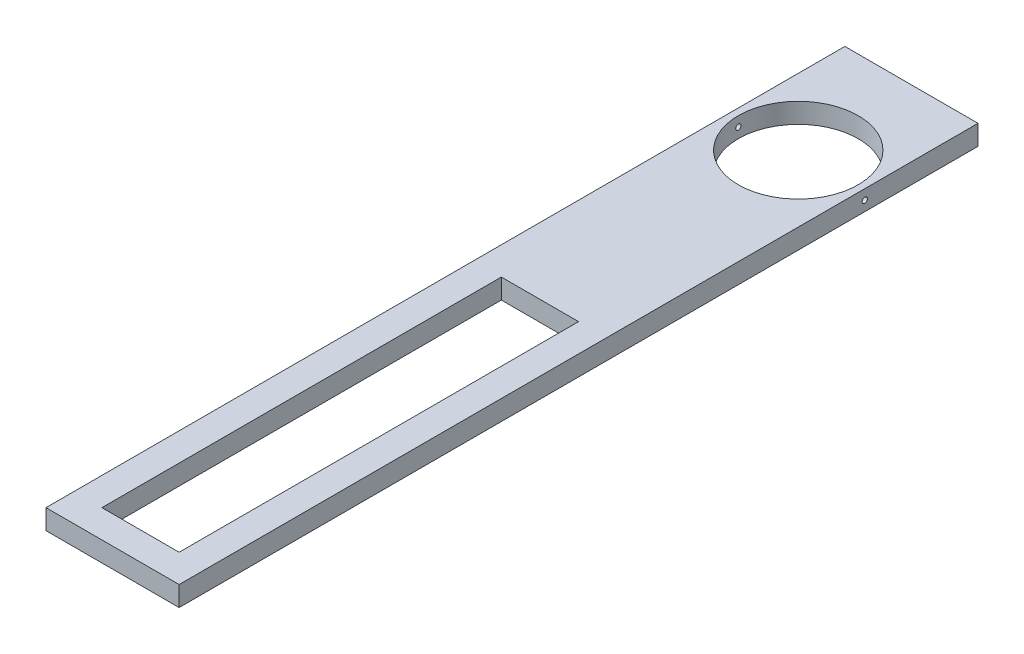
ISO-10303-21;
HEADER;
FILE_DESCRIPTION(('STEP AP214'),'2;1');
FILE_NAME('part.step','',(''),(''),'','','');
FILE_SCHEMA(('AUTOMOTIVE_DESIGN { 1 0 10303 214 1 1 1 1 }'));
ENDSEC;
DATA;
#1=APPLICATION_CONTEXT('core data for automotive mechanical design processes');
#2=APPLICATION_PROTOCOL_DEFINITION('international standard','automotive_design',2000,#1);
#3=PRODUCT_CONTEXT('',#1,'mechanical');
#4=PRODUCT('Part','Part','',(#3));
#5=PRODUCT_RELATED_PRODUCT_CATEGORY('part','',(#4));
#6=PRODUCT_DEFINITION_FORMATION('','',#4);
#7=PRODUCT_DEFINITION_CONTEXT('part definition',#1,'design');
#8=PRODUCT_DEFINITION('design','',#6,#7);
#9=PRODUCT_DEFINITION_SHAPE('','',#8);
#10=(LENGTH_UNIT() NAMED_UNIT(*) SI_UNIT(.MILLI.,.METRE.));
#11=(NAMED_UNIT(*) PLANE_ANGLE_UNIT() SI_UNIT($,.RADIAN.));
#12=(NAMED_UNIT(*) SI_UNIT($,.STERADIAN.) SOLID_ANGLE_UNIT());
#13=UNCERTAINTY_MEASURE_WITH_UNIT(LENGTH_MEASURE(1.E-05),#10,'distance_accuracy_value','');
#14=(GEOMETRIC_REPRESENTATION_CONTEXT(3) GLOBAL_UNCERTAINTY_ASSIGNED_CONTEXT((#13)) GLOBAL_UNIT_ASSIGNED_CONTEXT((#10,
#11,#12)) REPRESENTATION_CONTEXT('',''));
#15=CARTESIAN_POINT('',(0.,0.,0.));
#16=DIRECTION('',(0.,0.,1.));
#17=DIRECTION('',(1.,0.,0.));
#18=AXIS2_PLACEMENT_3D('',#15,#16,#17);
#19=CARTESIAN_POINT('',(0.,-15.,0.));
#20=DIRECTION('',(0.,1.,0.));
#21=DIRECTION('',(0.,0.,1.));
#22=AXIS2_PLACEMENT_3D('',#19,#20,#21);
#23=PLANE('',#22);
#24=CARTESIAN_POINT('',(0.,-15.,-344.));
#25=DIRECTION('',(0.,1.,0.));
#26=DIRECTION('',(0.,0.,1.));
#27=AXIS2_PLACEMENT_3D('',#24,#25,#26);
#28=CIRCLE('',#27,45.0000000000001);
#29=CARTESIAN_POINT('',(0.,-15.,-299.));
#30=VERTEX_POINT('',#29);
#31=EDGE_CURVE('E269',#30,#30,#28,.T.);
#32=ORIENTED_EDGE('',*,*,#31,.T.);
#33=EDGE_LOOP('',(#32));
#34=FACE_BOUND('',#33,.T.);
#35=DIRECTION('',(0.,0.,1.));
#36=VECTOR('',#35,1.);
#37=CARTESIAN_POINT('',(50.0000000000001,-15.,0.));
#38=LINE('',#37,#36);
#39=CARTESIAN_POINT('',(50.0000000000001,-15.,-429.));
#40=VERTEX_POINT('',#39);
#41=CARTESIAN_POINT('',(50.,-15.,171.));
#42=VERTEX_POINT('',#41);
#43=EDGE_CURVE('E165',#40,#42,#38,.T.);
#44=ORIENTED_EDGE('',*,*,#43,.T.);
#45=DIRECTION('',(1.,0.,0.));
#46=VECTOR('',#45,1.);
#47=CARTESIAN_POINT('',(0.,-15.,171.));
#48=LINE('',#47,#46);
#49=CARTESIAN_POINT('',(-50.,-15.,171.));
#50=VERTEX_POINT('',#49);
#51=EDGE_CURVE('E176',#50,#42,#48,.T.);
#52=ORIENTED_EDGE('',*,*,#51,.F.);
#53=DIRECTION('',(0.,0.,1.));
#54=VECTOR('',#53,1.);
#55=CARTESIAN_POINT('',(-50.,-15.,0.));
#56=LINE('',#55,#54);
#57=CARTESIAN_POINT('',(-50.0000000000001,-15.,-429.));
#58=VERTEX_POINT('',#57);
#59=EDGE_CURVE('E172',#58,#50,#56,.T.);
#60=ORIENTED_EDGE('',*,*,#59,.F.);
#61=DIRECTION('',(1.,0.,0.));
#62=VECTOR('',#61,1.);
#63=CARTESIAN_POINT('',(0.,-15.,-429.));
#64=LINE('',#63,#62);
#65=EDGE_CURVE('E168',#58,#40,#64,.T.);
#66=ORIENTED_EDGE('',*,*,#65,.T.);
#67=EDGE_LOOP('',(#44,#52,#60,#66));
#68=FACE_BOUND('',#67,.T.);
#69=DIRECTION('',(0.,0.,1.));
#70=VECTOR('',#69,1.);
#71=CARTESIAN_POINT('',(29.,-15.,0.));
#72=LINE('',#71,#70);
#73=CARTESIAN_POINT('',(29.,-15.,-150.));
#74=VERTEX_POINT('',#73);
#75=CARTESIAN_POINT('',(29.,-15.,150.));
#76=VERTEX_POINT('',#75);
#77=EDGE_CURVE('E161',#74,#76,#72,.T.);
#78=ORIENTED_EDGE('',*,*,#77,.F.);
#79=DIRECTION('',(1.,0.,0.));
#80=VECTOR('',#79,1.);
#81=CARTESIAN_POINT('',(0.,-15.,-150.));
#82=LINE('',#81,#80);
#83=CARTESIAN_POINT('',(-29.,-15.,-150.));
#84=VERTEX_POINT('',#83);
#85=EDGE_CURVE('E148',#84,#74,#82,.T.);
#86=ORIENTED_EDGE('',*,*,#85,.F.);
#87=DIRECTION('',(0.,0.,1.));
#88=VECTOR('',#87,1.);
#89=CARTESIAN_POINT('',(-29.,-15.,0.));
#90=LINE('',#89,#88);
#91=CARTESIAN_POINT('',(-29.,-15.,150.));
#92=VERTEX_POINT('',#91);
#93=EDGE_CURVE('E123',#84,#92,#90,.T.);
#94=ORIENTED_EDGE('',*,*,#93,.T.);
#95=DIRECTION('',(1.,0.,0.));
#96=VECTOR('',#95,1.);
#97=CARTESIAN_POINT('',(0.,-15.,150.));
#98=LINE('',#97,#96);
#99=EDGE_CURVE('E157',#92,#76,#98,.T.);
#100=ORIENTED_EDGE('',*,*,#99,.T.);
#101=EDGE_LOOP('',(#78,#86,#94,#100));
#102=FACE_BOUND('',#101,.T.);
#103=ADVANCED_FACE('F45',(#34,#68,#102),#23,.F.);
#104=CARTESIAN_POINT('',(0.,0.,0.));
#105=DIRECTION('',(0.,1.,0.));
#106=DIRECTION('',(0.,0.,1.));
#107=AXIS2_PLACEMENT_3D('',#104,#105,#106);
#108=PLANE('',#107);
#109=CARTESIAN_POINT('',(0.,0.,-344.));
#110=DIRECTION('',(0.,1.,0.));
#111=DIRECTION('',(0.,0.,1.));
#112=AXIS2_PLACEMENT_3D('',#109,#110,#111);
#113=CIRCLE('',#112,45.0000000000001);
#114=CARTESIAN_POINT('',(0.,0.,-299.));
#115=VERTEX_POINT('',#114);
#116=EDGE_CURVE('E272',#115,#115,#113,.T.);
#117=ORIENTED_EDGE('',*,*,#116,.F.);
#118=EDGE_LOOP('',(#117));
#119=FACE_BOUND('',#118,.T.);
#120=DIRECTION('',(0.,0.,1.));
#121=VECTOR('',#120,1.);
#122=CARTESIAN_POINT('',(50.0000000000001,0.,0.));
#123=LINE('',#122,#121);
#124=CARTESIAN_POINT('',(50.0000000000001,0.,-429.));
#125=VERTEX_POINT('',#124);
#126=CARTESIAN_POINT('',(50.,0.,171.));
#127=VERTEX_POINT('',#126);
#128=EDGE_CURVE('E164',#125,#127,#123,.T.);
#129=ORIENTED_EDGE('',*,*,#128,.F.);
#130=DIRECTION('',(1.,0.,0.));
#131=VECTOR('',#130,1.);
#132=CARTESIAN_POINT('',(0.,0.,-429.));
#133=LINE('',#132,#131);
#134=CARTESIAN_POINT('',(-50.0000000000001,0.,-429.));
#135=VERTEX_POINT('',#134);
#136=EDGE_CURVE('E184',#135,#125,#133,.T.);
#137=ORIENTED_EDGE('',*,*,#136,.F.);
#138=DIRECTION('',(0.,0.,1.));
#139=VECTOR('',#138,1.);
#140=CARTESIAN_POINT('',(-50.,0.,0.));
#141=LINE('',#140,#139);
#142=CARTESIAN_POINT('',(-50.,0.,171.));
#143=VERTEX_POINT('',#142);
#144=EDGE_CURVE('E187',#135,#143,#141,.T.);
#145=ORIENTED_EDGE('',*,*,#144,.T.);
#146=DIRECTION('',(1.,0.,0.));
#147=VECTOR('',#146,1.);
#148=CARTESIAN_POINT('',(0.,0.,171.));
#149=LINE('',#148,#147);
#150=EDGE_CURVE('E169',#143,#127,#149,.T.);
#151=ORIENTED_EDGE('',*,*,#150,.T.);
#152=EDGE_LOOP('',(#129,#137,#145,#151));
#153=FACE_BOUND('',#152,.T.);
#154=DIRECTION('',(1.,0.,0.));
#155=VECTOR('',#154,1.);
#156=CARTESIAN_POINT('',(0.,0.,-150.));
#157=LINE('',#156,#155);
#158=CARTESIAN_POINT('',(-29.,0.,-150.));
#159=VERTEX_POINT('',#158);
#160=CARTESIAN_POINT('',(29.,0.,-150.));
#161=VERTEX_POINT('',#160);
#162=EDGE_CURVE('E130',#159,#161,#157,.T.);
#163=ORIENTED_EDGE('',*,*,#162,.T.);
#164=DIRECTION('',(0.,0.,1.));
#165=VECTOR('',#164,1.);
#166=CARTESIAN_POINT('',(29.,0.,0.));
#167=LINE('',#166,#165);
#168=CARTESIAN_POINT('',(29.,0.,150.));
#169=VERTEX_POINT('',#168);
#170=EDGE_CURVE('E76',#161,#169,#167,.T.);
#171=ORIENTED_EDGE('',*,*,#170,.T.);
#172=DIRECTION('',(1.,0.,0.));
#173=VECTOR('',#172,1.);
#174=CARTESIAN_POINT('',(0.,0.,150.));
#175=LINE('',#174,#173);
#176=CARTESIAN_POINT('',(-29.,0.,150.));
#177=VERTEX_POINT('',#176);
#178=EDGE_CURVE('E137',#177,#169,#175,.T.);
#179=ORIENTED_EDGE('',*,*,#178,.F.);
#180=DIRECTION('',(0.,0.,1.));
#181=VECTOR('',#180,1.);
#182=CARTESIAN_POINT('',(-29.,0.,0.));
#183=LINE('',#182,#181);
#184=EDGE_CURVE('E120',#159,#177,#183,.T.);
#185=ORIENTED_EDGE('',*,*,#184,.F.);
#186=EDGE_LOOP('',(#163,#171,#179,#185));
#187=FACE_BOUND('',#186,.T.);
#188=ADVANCED_FACE('F135',(#119,#153,#187),#108,.T.);
#189=CARTESIAN_POINT('',(50.0000000000001,-15.,0.));
#190=DIRECTION('',(-1.,0.,0.));
#191=DIRECTION('',(0.,0.,1.));
#192=AXIS2_PLACEMENT_3D('',#189,#190,#191);
#193=PLANE('',#192);
#194=CARTESIAN_POINT('',(50.0000000000001,-7.5,-344.));
#195=DIRECTION('',(1.,0.,0.));
#196=DIRECTION('',(0.,0.,-1.));
#197=AXIS2_PLACEMENT_3D('',#194,#195,#196);
#198=CIRCLE('',#197,2.);
#199=CARTESIAN_POINT('',(50.0000000000001,-7.5,-346.));
#200=VERTEX_POINT('',#199);
#201=EDGE_CURVE('E281',#200,#200,#198,.T.);
#202=ORIENTED_EDGE('',*,*,#201,.F.);
#203=EDGE_LOOP('',(#202));
#204=FACE_BOUND('',#203,.T.);
#205=ORIENTED_EDGE('',*,*,#128,.T.);
#206=DIRECTION('',(0.,1.,0.));
#207=VECTOR('',#206,1.);
#208=CARTESIAN_POINT('',(50.,-15.,171.));
#209=LINE('',#208,#207);
#210=EDGE_CURVE('E11',#42,#127,#209,.T.);
#211=ORIENTED_EDGE('',*,*,#210,.F.);
#212=ORIENTED_EDGE('',*,*,#43,.F.);
#213=DIRECTION('',(0.,1.,0.));
#214=VECTOR('',#213,1.);
#215=CARTESIAN_POINT('',(50.0000000000001,-15.,-429.));
#216=LINE('',#215,#214);
#217=EDGE_CURVE('E180',#40,#125,#216,.T.);
#218=ORIENTED_EDGE('',*,*,#217,.T.);
#219=EDGE_LOOP('',(#205,#211,#212,#218));
#220=FACE_BOUND('',#219,.T.);
#221=ADVANCED_FACE('F47',(#204,#220),#193,.F.);
#222=CARTESIAN_POINT('',(0.,-15.,171.));
#223=DIRECTION('',(0.,0.,1.));
#224=DIRECTION('',(1.,0.,0.));
#225=AXIS2_PLACEMENT_3D('',#222,#223,#224);
#226=PLANE('',#225);
#227=ORIENTED_EDGE('',*,*,#150,.F.);
#228=DIRECTION('',(0.,1.,0.));
#229=VECTOR('',#228,1.);
#230=CARTESIAN_POINT('',(-50.,-15.,171.));
#231=LINE('',#230,#229);
#232=EDGE_CURVE('E60',#50,#143,#231,.T.);
#233=ORIENTED_EDGE('',*,*,#232,.F.);
#234=ORIENTED_EDGE('',*,*,#51,.T.);
#235=ORIENTED_EDGE('',*,*,#210,.T.);
#236=EDGE_LOOP('',(#227,#233,#234,#235));
#237=FACE_BOUND('',#236,.T.);
#238=ADVANCED_FACE('F237',(#237),#226,.T.);
#239=CARTESIAN_POINT('',(-50.,-15.,0.));
#240=DIRECTION('',(-1.,0.,0.));
#241=DIRECTION('',(0.,0.,1.));
#242=AXIS2_PLACEMENT_3D('',#239,#240,#241);
#243=PLANE('',#242);
#244=CARTESIAN_POINT('',(-50.0000000000001,-7.5,-344.));
#245=DIRECTION('',(1.,0.,0.));
#246=DIRECTION('',(0.,0.,-1.));
#247=AXIS2_PLACEMENT_3D('',#244,#245,#246);
#248=CIRCLE('',#247,2.);
#249=CARTESIAN_POINT('',(-50.0000000000001,-7.5,-346.));
#250=VERTEX_POINT('',#249);
#251=EDGE_CURVE('E207',#250,#250,#248,.T.);
#252=ORIENTED_EDGE('',*,*,#251,.T.);
#253=EDGE_LOOP('',(#252));
#254=FACE_BOUND('',#253,.T.);
#255=ORIENTED_EDGE('',*,*,#144,.F.);
#256=DIRECTION('',(0.,1.,0.));
#257=VECTOR('',#256,1.);
#258=CARTESIAN_POINT('',(-50.0000000000001,-15.,-429.));
#259=LINE('',#258,#257);
#260=EDGE_CURVE('E196',#58,#135,#259,.T.);
#261=ORIENTED_EDGE('',*,*,#260,.F.);
#262=ORIENTED_EDGE('',*,*,#59,.T.);
#263=ORIENTED_EDGE('',*,*,#232,.T.);
#264=EDGE_LOOP('',(#255,#261,#262,#263));
#265=FACE_BOUND('',#264,.T.);
#266=ADVANCED_FACE('F240',(#254,#265),#243,.T.);
#267=CARTESIAN_POINT('',(0.,-15.,-429.));
#268=DIRECTION('',(0.,0.,1.));
#269=DIRECTION('',(1.,0.,0.));
#270=AXIS2_PLACEMENT_3D('',#267,#268,#269);
#271=PLANE('',#270);
#272=ORIENTED_EDGE('',*,*,#136,.T.);
#273=ORIENTED_EDGE('',*,*,#217,.F.);
#274=ORIENTED_EDGE('',*,*,#65,.F.);
#275=ORIENTED_EDGE('',*,*,#260,.T.);
#276=EDGE_LOOP('',(#272,#273,#274,#275));
#277=FACE_BOUND('',#276,.T.);
#278=ADVANCED_FACE('F243',(#277),#271,.F.);
#279=CARTESIAN_POINT('',(29.,-65.,0.));
#280=DIRECTION('',(-1.,0.,0.));
#281=DIRECTION('',(0.,0.,1.));
#282=AXIS2_PLACEMENT_3D('',#279,#280,#281);
#283=PLANE('',#282);
#284=ORIENTED_EDGE('',*,*,#77,.T.);
#285=DIRECTION('',(0.,1.,0.));
#286=VECTOR('',#285,1.);
#287=CARTESIAN_POINT('',(29.,-65.,150.));
#288=LINE('',#287,#286);
#289=EDGE_CURVE('E145',#76,#169,#288,.T.);
#290=ORIENTED_EDGE('',*,*,#289,.T.);
#291=ORIENTED_EDGE('',*,*,#170,.F.);
#292=DIRECTION('',(0.,1.,0.));
#293=VECTOR('',#292,1.);
#294=CARTESIAN_POINT('',(29.,-65.,-150.));
#295=LINE('',#294,#293);
#296=EDGE_CURVE('E127',#74,#161,#295,.T.);
#297=ORIENTED_EDGE('',*,*,#296,.F.);
#298=EDGE_LOOP('',(#284,#290,#291,#297));
#299=FACE_BOUND('',#298,.T.);
#300=ADVANCED_FACE('F234',(#299),#283,.T.);
#301=CARTESIAN_POINT('',(0.,-65.,150.));
#302=DIRECTION('',(0.,0.,1.));
#303=DIRECTION('',(1.,0.,0.));
#304=AXIS2_PLACEMENT_3D('',#301,#302,#303);
#305=PLANE('',#304);
#306=DIRECTION('',(0.,1.,0.));
#307=VECTOR('',#306,1.);
#308=CARTESIAN_POINT('',(-29.,-65.,150.));
#309=LINE('',#308,#307);
#310=EDGE_CURVE('E126',#92,#177,#309,.T.);
#311=ORIENTED_EDGE('',*,*,#310,.T.);
#312=ORIENTED_EDGE('',*,*,#178,.T.);
#313=ORIENTED_EDGE('',*,*,#289,.F.);
#314=ORIENTED_EDGE('',*,*,#99,.F.);
#315=EDGE_LOOP('',(#311,#312,#313,#314));
#316=FACE_BOUND('',#315,.T.);
#317=ADVANCED_FACE('F250',(#316),#305,.F.);
#318=CARTESIAN_POINT('',(-29.,-65.,0.));
#319=DIRECTION('',(-1.,0.,0.));
#320=DIRECTION('',(0.,0.,1.));
#321=AXIS2_PLACEMENT_3D('',#318,#319,#320);
#322=PLANE('',#321);
#323=DIRECTION('',(0.,1.,0.));
#324=VECTOR('',#323,1.);
#325=CARTESIAN_POINT('',(-29.,-65.,-150.));
#326=LINE('',#325,#324);
#327=EDGE_CURVE('E68',#84,#159,#326,.T.);
#328=ORIENTED_EDGE('',*,*,#327,.T.);
#329=ORIENTED_EDGE('',*,*,#184,.T.);
#330=ORIENTED_EDGE('',*,*,#310,.F.);
#331=ORIENTED_EDGE('',*,*,#93,.F.);
#332=EDGE_LOOP('',(#328,#329,#330,#331));
#333=FACE_BOUND('',#332,.T.);
#334=ADVANCED_FACE('F117',(#333),#322,.F.);
#335=CARTESIAN_POINT('',(0.,-65.,-150.));
#336=DIRECTION('',(0.,0.,1.));
#337=DIRECTION('',(1.,0.,0.));
#338=AXIS2_PLACEMENT_3D('',#335,#336,#337);
#339=PLANE('',#338);
#340=ORIENTED_EDGE('',*,*,#85,.T.);
#341=ORIENTED_EDGE('',*,*,#296,.T.);
#342=ORIENTED_EDGE('',*,*,#162,.F.);
#343=ORIENTED_EDGE('',*,*,#327,.F.);
#344=EDGE_LOOP('',(#340,#341,#342,#343));
#345=FACE_BOUND('',#344,.T.);
#346=ADVANCED_FACE('F131',(#345),#339,.T.);
#347=CARTESIAN_POINT('',(0.,-15.,-344.));
#348=DIRECTION('',(0.,1.,0.));
#349=DIRECTION('',(0.,0.,1.));
#350=AXIS2_PLACEMENT_3D('',#347,#348,#349);
#351=CYLINDRICAL_SURFACE('',#350,45.0000000000001);
#352=CARTESIAN_POINT('',(-44.9555335859781,-7.5,-346.));
#353=CARTESIAN_POINT('',(-44.9555341841904,-7.61228133853667,-345.999995039354));
#354=CARTESIAN_POINT('',(-44.9559587587024,-7.7246426794439,-345.990512924762));
#355=CARTESIAN_POINT('',(-44.9576115160318,-7.94626678645635,-345.952820758587));
#356=CARTESIAN_POINT('',(-44.9588406499609,-8.05552572535085,-345.924588540951));
#357=CARTESIAN_POINT('',(-44.9619630207017,-8.26770244052117,-345.850205126236));
#358=CARTESIAN_POINT('',(-44.9638559234039,-8.37062337646211,-345.804062942935));
#359=CARTESIAN_POINT('',(-44.9680921161511,-8.56723063774078,-345.695182950015));
#360=CARTESIAN_POINT('',(-44.9704352986574,-8.66091915995728,-345.632449101582));
#361=CARTESIAN_POINT('',(-44.9753102526031,-8.8365080754858,-345.492108020511));
#362=CARTESIAN_POINT('',(-44.9778421589543,-8.91839991071841,-345.414490084209));
#363=CARTESIAN_POINT('',(-44.9828079768747,-9.06799806176566,-345.246605019312));
#364=CARTESIAN_POINT('',(-44.9852418844728,-9.13570380321022,-345.156337378801));
#365=CARTESIAN_POINT('',(-44.9897383728319,-9.25502949708341,-344.965672915264));
#366=CARTESIAN_POINT('',(-44.9918008062709,-9.30664307346028,-344.865272098066));
#367=CARTESIAN_POINT('',(-44.9953206023184,-9.3922783100723,-344.657219477755));
#368=CARTESIAN_POINT('',(-44.9967779687991,-9.42630008289006,-344.549567721051));
#369=CARTESIAN_POINT('',(-44.9989225133547,-9.47576414840181,-344.330145152855));
#370=CARTESIAN_POINT('',(-44.9996102045236,-9.49121881911963,-344.218377136815));
#371=CARTESIAN_POINT('',(-45.0001396151583,-9.5031481651768,-343.993831238996));
#372=CARTESIAN_POINT('',(-44.9999813402058,-9.49962296574699,-343.881053363885));
#373=CARTESIAN_POINT('',(-44.9988370897975,-9.47370294611785,-343.65777291154));
#374=CARTESIAN_POINT('',(-44.9978516990424,-9.45132145567446,-343.547268783481));
#375=CARTESIAN_POINT('',(-44.995164903508,-9.38834483520891,-343.33158770445));
#376=CARTESIAN_POINT('',(-44.9934634961919,-9.34774964065748,-343.226410772354));
#377=CARTESIAN_POINT('',(-44.9895353464602,-9.24948272721647,-343.024326727857));
#378=CARTESIAN_POINT('',(-44.9873084168984,-9.19180492309112,-342.927422578294));
#379=CARTESIAN_POINT('',(-44.9825800696049,-9.06101451047283,-342.744667257496));
#380=CARTESIAN_POINT('',(-44.9800786503646,-8.98790181714429,-342.658816147018));
#381=CARTESIAN_POINT('',(-44.9750805346801,-8.82824164244037,-342.500526178373));
#382=CARTESIAN_POINT('',(-44.9725838441911,-8.74168259722128,-342.42809898345));
#383=CARTESIAN_POINT('',(-44.9678788345254,-8.55762748385122,-342.298802614259));
#384=CARTESIAN_POINT('',(-44.9656705154142,-8.46013141321971,-342.241933443519));
#385=CARTESIAN_POINT('',(-44.9617914354948,-8.25696291487616,-342.145368524757));
#386=CARTESIAN_POINT('',(-44.9601206877975,-8.15129028782342,-342.10567319558));
#387=CARTESIAN_POINT('',(-44.9575056715425,-7.93477144132597,-342.044590460139));
#388=CARTESIAN_POINT('',(-44.9565613986659,-7.82392525264206,-342.023202945035));
#389=CARTESIAN_POINT('',(-44.9555066083098,-7.60030735511117,-341.999357337799));
#390=CARTESIAN_POINT('',(-44.955395378235,-7.4875373746947,-341.996883067001));
#391=CARTESIAN_POINT('',(-44.9560173565676,-7.26318376936907,-342.010891982926));
#392=CARTESIAN_POINT('',(-44.9567505627782,-7.15160014137446,-342.027375120332));
#393=CARTESIAN_POINT('',(-44.958978119406,-6.93283203242439,-342.078817545253));
#394=CARTESIAN_POINT('',(-44.9604721654596,-6.82564581085958,-342.113769444803));
#395=CARTESIAN_POINT('',(-44.9640527403978,-6.61866156912277,-342.201149759336));
#396=CARTESIAN_POINT('',(-44.9661392719805,-6.5188635825977,-342.253578253905));
#397=CARTESIAN_POINT('',(-44.9706713691241,-6.32941424274194,-342.374465090247));
#398=CARTESIAN_POINT('',(-44.9731171778943,-6.23976983616556,-342.442934309466));
#399=CARTESIAN_POINT('',(-44.9780912879105,-6.0732421756587,-342.593943089054));
#400=CARTESIAN_POINT('',(-44.9806195895796,-5.99635898720501,-342.676482721614));
#401=CARTESIAN_POINT('',(-44.9854757845969,-5.85748194204508,-342.853358759679));
#402=CARTESIAN_POINT('',(-44.9878035366424,-5.79549852921964,-342.947703369766));
#403=CARTESIAN_POINT('',(-44.991994257311,-5.68825190109441,-343.145469694279));
#404=CARTESIAN_POINT('',(-44.9938572276388,-5.64298862446968,-343.24889137541));
#405=CARTESIAN_POINT('',(-44.9969077365208,-5.57048541789524,-343.461837057404));
#406=CARTESIAN_POINT('',(-44.9980955264549,-5.54323877945984,-343.571358770436));
#407=CARTESIAN_POINT('',(-44.99966280013,-5.50752030489409,-343.793427729875));
#408=CARTESIAN_POINT('',(-45.0000422871674,-5.49904839219807,-343.905974963943));
#409=CARTESIAN_POINT('',(-44.9999502010503,-5.501120626378,-344.130796346592));
#410=CARTESIAN_POINT('',(-44.9994793618548,-5.51164837369363,-344.243070647005));
#411=CARTESIAN_POINT('',(-44.9977410878861,-5.55138722734484,-344.464256237335));
#412=CARTESIAN_POINT('',(-44.9964736515829,-5.58059836956394,-344.573167520792));
#413=CARTESIAN_POINT('',(-44.9932848311702,-5.65687165926073,-344.78453944907));
#414=CARTESIAN_POINT('',(-44.9913634397054,-5.70393400751788,-344.887000021321));
#415=CARTESIAN_POINT('',(-44.9870829282496,-5.8145705113621,-345.082565721415));
#416=CARTESIAN_POINT('',(-44.9847238224784,-5.87814413058011,-345.175671153023));
#417=CARTESIAN_POINT('',(-44.9798312205853,-6.02005573434362,-345.349964594701));
#418=CARTESIAN_POINT('',(-44.9772975941683,-6.09840482760571,-345.431143555805));
#419=CARTESIAN_POINT('',(-44.9723422534298,-6.2676421160558,-345.579220424975));
#420=CARTESIAN_POINT('',(-44.9699205668538,-6.35853339793851,-345.646114807179));
#421=CARTESIAN_POINT('',(-44.9654608632241,-6.55033461918262,-345.763748393737));
#422=CARTESIAN_POINT('',(-44.9634231766297,-6.65125307462245,-345.814473709179));
#423=CARTESIAN_POINT('',(-44.9599667140749,-6.8601068003266,-345.898200613779));
#424=CARTESIAN_POINT('',(-44.9585472051515,-6.96803358541278,-345.931223203558));
#425=CARTESIAN_POINT('',(-44.9568642055108,-7.14719554442361,-345.969915965991));
#426=CARTESIAN_POINT('',(-44.9563674130239,-7.21726942046326,-345.981183143991));
#427=CARTESIAN_POINT('',(-44.9557019144783,-7.35821822956475,-345.996226724846));
#428=CARTESIAN_POINT('',(-44.9555332082008,-7.42909316209207,-346.0000031327));
#429=CARTESIAN_POINT('',(-44.9555335859781,-7.5,-346.));
#430=B_SPLINE_CURVE_WITH_KNOTS('',3,(#352,#353,#354,#355,#356,#357,#358,#359,#360,#361,#362,
#363,#364,#365,#366,#367,#368,#369,#370,#371,#372,#373,#374,#375,#376,#377,#378,#379,#380,#381,
#382,#383,#384,#385,#386,#387,#388,#389,#390,#391,#392,#393,#394,#395,#396,#397,#398,#399,#400,
#401,#402,#403,#404,#405,#406,#407,#408,#409,#410,#411,#412,#413,#414,#415,#416,#417,#418,#419,
#420,#421,#422,#423,#424,#425,#426,#427,#428,#429),.UNSPECIFIED.,.T.,.F.,(4,2,2,2,2,2,2,2,2,2,2,
2,2,2,2,2,2,2,2,2,2,2,2,2,2,2,2,2,2,2,2,2,2,2,2,2,2,2,4),(0.,0.336585184359086,
0.673568983982974,1.01038340493083,1.34711748542651,1.6840946374325,2.02108543041745,
2.35820957700209,2.69533156605994,3.03222868299165,3.36912357704952,3.70578051538616,
4.0424386464729,4.37921684780845,4.71599690024406,5.05306820306642,5.39013958233701,
5.72721918184421,6.06429677740884,6.40108599960225,6.73787434566851,7.0745280698623,
7.41118332712394,7.74806753933369,8.08495348001605,8.42207487415506,8.75919503181199,
9.09618959216584,9.43318277821129,9.76988522762597,10.1065883237166,10.4432952069505,
10.7799911536208,11.116941256594,11.4539744330447,11.7912963390812,12.1282171919274,
12.3407743928418,12.5533314519275),.UNSPECIFIED.);
#431=CARTESIAN_POINT('',(-44.9555335859781,-7.5,-346.));
#432=VERTEX_POINT('',#431);
#433=EDGE_CURVE('E49',#432,#432,#430,.T.);
#434=ORIENTED_EDGE('',*,*,#433,.T.);
#435=EDGE_LOOP('',(#434));
#436=FACE_BOUND('',#435,.T.);
#437=CARTESIAN_POINT('',(44.9555335859781,-7.5,-346.));
#438=CARTESIAN_POINT('',(44.9555341841904,-7.38771866146333,-345.999995039354));
#439=CARTESIAN_POINT('',(44.9559587587024,-7.2753573205561,-345.990512924762));
#440=CARTESIAN_POINT('',(44.9576115160318,-7.05373321354366,-345.952820758587));
#441=CARTESIAN_POINT('',(44.9588406499609,-6.94447427464915,-345.924588540951));
#442=CARTESIAN_POINT('',(44.9619630207017,-6.73229755947885,-345.850205126236));
#443=CARTESIAN_POINT('',(44.9638559234039,-6.62937662353791,-345.804062942935));
#444=CARTESIAN_POINT('',(44.9680921161511,-6.43276936225924,-345.695182950015));
#445=CARTESIAN_POINT('',(44.9704352986574,-6.33908084004273,-345.632449101582));
#446=CARTESIAN_POINT('',(44.9753102526031,-6.16349192451421,-345.492108020511));
#447=CARTESIAN_POINT('',(44.9778421589543,-6.08160008928159,-345.414490084209));
#448=CARTESIAN_POINT('',(44.9828079768747,-5.93200193823434,-345.246605019312));
#449=CARTESIAN_POINT('',(44.9852418844728,-5.86429619678979,-345.156337378801));
#450=CARTESIAN_POINT('',(44.9897383728319,-5.7449705029166,-344.965672915264));
#451=CARTESIAN_POINT('',(44.9918008062709,-5.69335692653972,-344.865272098066));
#452=CARTESIAN_POINT('',(44.9953206023184,-5.6077216899277,-344.657219477755));
#453=CARTESIAN_POINT('',(44.9967779687991,-5.57369991710995,-344.549567721051));
#454=CARTESIAN_POINT('',(44.9989225133547,-5.5242358515982,-344.330145152855));
#455=CARTESIAN_POINT('',(44.9996102045236,-5.50878118088037,-344.218377136815));
#456=CARTESIAN_POINT('',(45.0001396151583,-5.4968518348232,-343.993831238996));
#457=CARTESIAN_POINT('',(44.9999813402058,-5.50037703425302,-343.881053363885));
#458=CARTESIAN_POINT('',(44.9988370897975,-5.52629705388215,-343.65777291154));
#459=CARTESIAN_POINT('',(44.9978516990424,-5.54867854432554,-343.547268783481));
#460=CARTESIAN_POINT('',(44.995164903508,-5.61165516479109,-343.33158770445));
#461=CARTESIAN_POINT('',(44.9934634961919,-5.65225035934252,-343.226410772354));
#462=CARTESIAN_POINT('',(44.9895353464602,-5.75051727278353,-343.024326727857));
#463=CARTESIAN_POINT('',(44.9873084168984,-5.80819507690888,-342.927422578294));
#464=CARTESIAN_POINT('',(44.9825800696049,-5.93898548952717,-342.744667257496));
#465=CARTESIAN_POINT('',(44.9800786503646,-6.01209818285571,-342.658816147018));
#466=CARTESIAN_POINT('',(44.9750805346801,-6.17175835755964,-342.500526178373));
#467=CARTESIAN_POINT('',(44.9725838441911,-6.25831740277872,-342.42809898345));
#468=CARTESIAN_POINT('',(44.9678788345254,-6.44237251614879,-342.298802614259));
#469=CARTESIAN_POINT('',(44.9656705154142,-6.5398685867803,-342.241933443519));
#470=CARTESIAN_POINT('',(44.9617914354948,-6.74303708512385,-342.145368524757));
#471=CARTESIAN_POINT('',(44.9601206877975,-6.84870971217659,-342.10567319558));
#472=CARTESIAN_POINT('',(44.9575056715425,-7.06522855867404,-342.044590460139));
#473=CARTESIAN_POINT('',(44.9565613986659,-7.17607474735794,-342.023202945035));
#474=CARTESIAN_POINT('',(44.9555066083098,-7.39969264488883,-341.999357337799));
#475=CARTESIAN_POINT('',(44.955395378235,-7.5124626253053,-341.996883067001));
#476=CARTESIAN_POINT('',(44.9560173565676,-7.73681623063094,-342.010891982926));
#477=CARTESIAN_POINT('',(44.9567505627782,-7.84839985862554,-342.027375120332));
#478=CARTESIAN_POINT('',(44.958978119406,-8.06716796757562,-342.078817545253));
#479=CARTESIAN_POINT('',(44.9604721654596,-8.17435418914043,-342.113769444803));
#480=CARTESIAN_POINT('',(44.9640527403978,-8.38133843087723,-342.201149759336));
#481=CARTESIAN_POINT('',(44.9661392719805,-8.4811364174023,-342.253578253905));
#482=CARTESIAN_POINT('',(44.9706713691241,-8.67058575725807,-342.374465090247));
#483=CARTESIAN_POINT('',(44.9731171778943,-8.76023016383447,-342.442934309466));
#484=CARTESIAN_POINT('',(44.9780912879105,-8.92675782434133,-342.593943089054));
#485=CARTESIAN_POINT('',(44.9806195895796,-9.003641012795,-342.676482721614));
#486=CARTESIAN_POINT('',(44.9854757845969,-9.14251805795492,-342.853358759679));
#487=CARTESIAN_POINT('',(44.9878035366424,-9.20450147078036,-342.947703369766));
#488=CARTESIAN_POINT('',(44.991994257311,-9.3117480989056,-343.145469694279));
#489=CARTESIAN_POINT('',(44.9938572276388,-9.35701137553032,-343.24889137541));
#490=CARTESIAN_POINT('',(44.9969077365208,-9.42951458210476,-343.461837057404));
#491=CARTESIAN_POINT('',(44.9980955264549,-9.45676122054017,-343.571358770436));
#492=CARTESIAN_POINT('',(44.99966280013,-9.49247969510592,-343.793427729875));
#493=CARTESIAN_POINT('',(45.0000422871674,-9.50095160780194,-343.905974963943));
#494=CARTESIAN_POINT('',(44.9999502010503,-9.498879373622,-344.130796346592));
#495=CARTESIAN_POINT('',(44.9994793618548,-9.48835162630638,-344.243070647005));
#496=CARTESIAN_POINT('',(44.9977410878861,-9.44861277265517,-344.464256237335));
#497=CARTESIAN_POINT('',(44.9964736515829,-9.41940163043606,-344.573167520792));
#498=CARTESIAN_POINT('',(44.9932848311702,-9.34312834073928,-344.78453944907));
#499=CARTESIAN_POINT('',(44.9913634397054,-9.29606599248212,-344.887000021321));
#500=CARTESIAN_POINT('',(44.9870829282496,-9.18542948863791,-345.082565721415));
#501=CARTESIAN_POINT('',(44.9847238224784,-9.12185586941989,-345.175671153023));
#502=CARTESIAN_POINT('',(44.9798312205853,-8.97994426565638,-345.349964594701));
#503=CARTESIAN_POINT('',(44.9772975941683,-8.90159517239429,-345.431143555805));
#504=CARTESIAN_POINT('',(44.9723422534298,-8.73235788394421,-345.579220424975));
#505=CARTESIAN_POINT('',(44.9699205668538,-8.64146660206149,-345.646114807179));
#506=CARTESIAN_POINT('',(44.9654608632241,-8.44966538081738,-345.763748393737));
#507=CARTESIAN_POINT('',(44.9634231766297,-8.34874692537754,-345.814473709179));
#508=CARTESIAN_POINT('',(44.9599667140749,-8.13989319967339,-345.898200613779));
#509=CARTESIAN_POINT('',(44.9585472051515,-8.03196641458722,-345.931223203558));
#510=CARTESIAN_POINT('',(44.9568642055108,-7.85280445557639,-345.969915965991));
#511=CARTESIAN_POINT('',(44.9563674130239,-7.78273057953675,-345.981183143991));
#512=CARTESIAN_POINT('',(44.9557019144783,-7.64178177043525,-345.996226724846));
#513=CARTESIAN_POINT('',(44.9555332082008,-7.57090683790794,-346.0000031327));
#514=CARTESIAN_POINT('',(44.9555335859781,-7.5,-346.));
#515=B_SPLINE_CURVE_WITH_KNOTS('',3,(#437,#438,#439,#440,#441,#442,#443,#444,#445,#446,#447,
#448,#449,#450,#451,#452,#453,#454,#455,#456,#457,#458,#459,#460,#461,#462,#463,#464,#465,#466,
#467,#468,#469,#470,#471,#472,#473,#474,#475,#476,#477,#478,#479,#480,#481,#482,#483,#484,#485,
#486,#487,#488,#489,#490,#491,#492,#493,#494,#495,#496,#497,#498,#499,#500,#501,#502,#503,#504,
#505,#506,#507,#508,#509,#510,#511,#512,#513,#514),.UNSPECIFIED.,.T.,.F.,(4,2,2,2,2,2,2,2,2,2,2,
2,2,2,2,2,2,2,2,2,2,2,2,2,2,2,2,2,2,2,2,2,2,2,2,2,2,2,4),(0.,0.336585184359084,
0.673568983982973,1.01038340493081,1.34711748542651,1.6840946374325,2.02108543041744,
2.35820957700209,2.69533156605994,3.03222868299165,3.36912357704952,3.70578051538616,
4.0424386464729,4.37921684780845,4.71599690024406,5.05306820306642,5.39013958233701,
5.7272191818442,6.06429677740883,6.40108599960224,6.73787434566851,7.0745280698623,
7.41118332712393,7.74806753933371,8.08495348001605,8.42207487415506,8.75919503181199,
9.09618959216584,9.43318277821129,9.76988522762597,10.1065883237166,10.4432952069505,
10.7799911536207,11.116941256594,11.4539744330447,11.7912963390812,12.1282171919274,
12.3407743928418,12.5533314519275),.UNSPECIFIED.);
#516=CARTESIAN_POINT('',(44.9555335859781,-7.5,-346.));
#517=VERTEX_POINT('',#516);
#518=EDGE_CURVE('E201',#517,#517,#515,.T.);
#519=ORIENTED_EDGE('',*,*,#518,.T.);
#520=EDGE_LOOP('',(#519));
#521=FACE_BOUND('',#520,.T.);
#522=ORIENTED_EDGE('',*,*,#31,.F.);
#523=EDGE_LOOP('',(#522));
#524=FACE_BOUND('',#523,.T.);
#525=ORIENTED_EDGE('',*,*,#116,.T.);
#526=EDGE_LOOP('',(#525));
#527=FACE_BOUND('',#526,.T.);
#528=ADVANCED_FACE('F208',(#436,#521,#524,#527),#351,.F.);
#529=CARTESIAN_POINT('',(-50.0000000000001,-7.5,-344.));
#530=DIRECTION('',(1.,0.,0.));
#531=DIRECTION('',(0.,0.,-1.));
#532=AXIS2_PLACEMENT_3D('',#529,#530,#531);
#533=CYLINDRICAL_SURFACE('',#532,2.);
#534=ORIENTED_EDGE('',*,*,#201,.T.);
#535=EDGE_LOOP('',(#534));
#536=FACE_BOUND('',#535,.T.);
#537=ORIENTED_EDGE('',*,*,#518,.F.);
#538=EDGE_LOOP('',(#537));
#539=FACE_BOUND('',#538,.T.);
#540=ADVANCED_FACE('F214',(#536,#539),#533,.F.);
#541=ORIENTED_EDGE('',*,*,#251,.F.);
#542=EDGE_LOOP('',(#541));
#543=FACE_BOUND('',#542,.T.);
#544=ORIENTED_EDGE('',*,*,#433,.F.);
#545=EDGE_LOOP('',(#544));
#546=FACE_BOUND('',#545,.T.);
#547=ADVANCED_FACE('F211',(#543,#546),#533,.F.);
#548=CLOSED_SHELL('',(#103,#188,#221,#238,#266,#278,#300,#317,#334,#346,#528,#540,#547));
#549=MANIFOLD_SOLID_BREP('B2',#548);
#550=ADVANCED_BREP_SHAPE_REPRESENTATION('',(#18,#549),#14);
#551=SHAPE_DEFINITION_REPRESENTATION(#9,#550);
ENDSEC;
END-ISO-10303-21;
